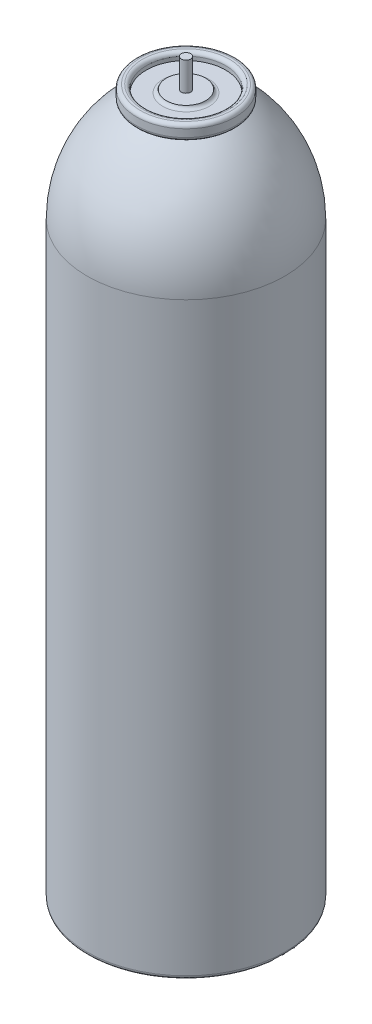
ISO-10303-21;
HEADER;
FILE_DESCRIPTION(('STEP AP214'),'2;1');
FILE_NAME('part.step','',(''),(''),'','','');
FILE_SCHEMA(('AUTOMOTIVE_DESIGN { 1 0 10303 214 1 1 1 1 }'));
ENDSEC;
DATA;
#1=APPLICATION_CONTEXT('core data for automotive mechanical design processes');
#2=APPLICATION_PROTOCOL_DEFINITION('international standard','automotive_design',2000,#1);
#3=PRODUCT_CONTEXT('',#1,'mechanical');
#4=PRODUCT('Part','Part','',(#3));
#5=PRODUCT_RELATED_PRODUCT_CATEGORY('part','',(#4));
#6=PRODUCT_DEFINITION_FORMATION('','',#4);
#7=PRODUCT_DEFINITION_CONTEXT('part definition',#1,'design');
#8=PRODUCT_DEFINITION('design','',#6,#7);
#9=PRODUCT_DEFINITION_SHAPE('','',#8);
#10=(LENGTH_UNIT() NAMED_UNIT(*) SI_UNIT(.MILLI.,.METRE.));
#11=(NAMED_UNIT(*) PLANE_ANGLE_UNIT() SI_UNIT($,.RADIAN.));
#12=(NAMED_UNIT(*) SI_UNIT($,.STERADIAN.) SOLID_ANGLE_UNIT());
#13=UNCERTAINTY_MEASURE_WITH_UNIT(LENGTH_MEASURE(1.E-05),#10,'distance_accuracy_value','');
#14=(GEOMETRIC_REPRESENTATION_CONTEXT(3) GLOBAL_UNCERTAINTY_ASSIGNED_CONTEXT((#13)) GLOBAL_UNIT_ASSIGNED_CONTEXT((#10,
#11,#12)) REPRESENTATION_CONTEXT('',''));
#15=CARTESIAN_POINT('',(0.,0.,0.));
#16=DIRECTION('',(0.,0.,1.));
#17=DIRECTION('',(1.,0.,0.));
#18=AXIS2_PLACEMENT_3D('',#15,#16,#17);
#19=CARTESIAN_POINT('',(0.,-195.980371030515,0.));
#20=DIRECTION('',(0.,-1.,0.));
#21=DIRECTION('',(0.,0.,-1.));
#22=AXIS2_PLACEMENT_3D('',#19,#20,#21);
#23=CYLINDRICAL_SURFACE('',#22,33.3375);
#24=CARTESIAN_POINT('',(0.,1.26999999999999,0.));
#25=DIRECTION('',(0.,-1.,0.));
#26=DIRECTION('',(0.,0.,-1.));
#27=AXIS2_PLACEMENT_3D('',#24,#25,#26);
#28=CIRCLE('',#27,33.3375);
#29=CARTESIAN_POINT('',(0.,1.26999999999999,-33.3375));
#30=VERTEX_POINT('',#29);
#31=EDGE_CURVE('E53',#30,#30,#28,.F.);
#32=ORIENTED_EDGE('',*,*,#31,.T.);
#33=EDGE_LOOP('',(#32));
#34=FACE_BOUND('',#33,.T.);
#35=CARTESIAN_POINT('',(0.,198.713653717167,0.));
#36=DIRECTION('',(0.,-1.,0.));
#37=DIRECTION('',(0.,0.,-1.));
#38=AXIS2_PLACEMENT_3D('',#35,#36,#37);
#39=CIRCLE('',#38,33.3375);
#40=CARTESIAN_POINT('',(0.,198.713653717167,-33.3375));
#41=VERTEX_POINT('',#40);
#42=EDGE_CURVE('E89',#41,#41,#39,.T.);
#43=ORIENTED_EDGE('',*,*,#42,.T.);
#44=EDGE_LOOP('',(#43));
#45=FACE_BOUND('',#44,.T.);
#46=ADVANCED_FACE('F39',(#34,#45),#23,.T.);
#47=CARTESIAN_POINT('',(0.,198.713653717167,0.));
#48=DIRECTION('',(0.,-1.,0.));
#49=DIRECTION('',(0.,0.,-1.));
#50=AXIS2_PLACEMENT_3D('',#47,#48,#49);
#51=DEGENERATE_TOROIDAL_SURFACE('',#50,8.4454704817287,41.7829704817287,.F.);
#52=CARTESIAN_POINT('',(0.,233.045,0.));
#53=DIRECTION('',(0.,-1.,0.));
#54=DIRECTION('',(0.,0.,-1.));
#55=AXIS2_PLACEMENT_3D('',#52,#53,#54);
#56=CIRCLE('',#55,15.369971665861);
#57=CARTESIAN_POINT('',(0.,233.045,-15.369971665861));
#58=VERTEX_POINT('',#57);
#59=EDGE_CURVE('E86',#58,#58,#56,.T.);
#60=ORIENTED_EDGE('',*,*,#59,.T.);
#61=EDGE_LOOP('',(#60));
#62=FACE_BOUND('',#61,.T.);
#63=ORIENTED_EDGE('',*,*,#42,.F.);
#64=EDGE_LOOP('',(#63));
#65=FACE_BOUND('',#64,.T.);
#66=ADVANCED_FACE('F127',(#62,#65),#51,.F.);
#67=CARTESIAN_POINT('',(0.,233.045,0.));
#68=DIRECTION('',(0.,-1.,0.));
#69=DIRECTION('',(0.,0.,-1.));
#70=AXIS2_PLACEMENT_3D('',#67,#68,#69);
#71=PLANE('',#70);
#72=CARTESIAN_POINT('',(0.,233.045,0.));
#73=DIRECTION('',(0.,-1.,0.));
#74=DIRECTION('',(0.,0.,-1.));
#75=AXIS2_PLACEMENT_3D('',#72,#73,#74);
#76=CIRCLE('',#75,15.3924);
#77=CARTESIAN_POINT('',(0.,233.045,-15.3924));
#78=VERTEX_POINT('',#77);
#79=EDGE_CURVE('E80',#78,#78,#76,.T.);
#80=ORIENTED_EDGE('',*,*,#79,.T.);
#81=EDGE_LOOP('',(#80));
#82=FACE_BOUND('',#81,.T.);
#83=ORIENTED_EDGE('',*,*,#59,.F.);
#84=EDGE_LOOP('',(#83));
#85=FACE_BOUND('',#84,.T.);
#86=ADVANCED_FACE('F138',(#82,#85),#71,.T.);
#87=CARTESIAN_POINT('',(0.,-195.980371030515,0.));
#88=DIRECTION('',(0.,-1.,0.));
#89=DIRECTION('',(0.,0.,-1.));
#90=AXIS2_PLACEMENT_3D('',#87,#88,#89);
#91=CYLINDRICAL_SURFACE('',#90,16.6624);
#92=CARTESIAN_POINT('',(0.,234.315,0.));
#93=DIRECTION('',(0.,-1.,0.));
#94=DIRECTION('',(0.,0.,-1.));
#95=AXIS2_PLACEMENT_3D('',#92,#93,#94);
#96=CIRCLE('',#95,16.6624);
#97=CARTESIAN_POINT('',(0.,234.315,-16.6624));
#98=VERTEX_POINT('',#97);
#99=EDGE_CURVE('E71',#98,#98,#96,.F.);
#100=ORIENTED_EDGE('',*,*,#99,.T.);
#101=EDGE_LOOP('',(#100));
#102=FACE_BOUND('',#101,.T.);
#103=CARTESIAN_POINT('',(0.,236.855,0.));
#104=DIRECTION('',(0.,-1.,0.));
#105=DIRECTION('',(0.,0.,-1.));
#106=AXIS2_PLACEMENT_3D('',#103,#104,#105);
#107=CIRCLE('',#106,16.6624);
#108=CARTESIAN_POINT('',(0.,236.855,-16.6624));
#109=VERTEX_POINT('',#108);
#110=EDGE_CURVE('E72',#109,#109,#107,.T.);
#111=ORIENTED_EDGE('',*,*,#110,.T.);
#112=EDGE_LOOP('',(#111));
#113=FACE_BOUND('',#112,.T.);
#114=ADVANCED_FACE('F177',(#102,#113),#91,.T.);
#115=CARTESIAN_POINT('',(0.,238.125,0.));
#116=DIRECTION('',(0.,-1.,0.));
#117=DIRECTION('',(0.,0.,-1.));
#118=AXIS2_PLACEMENT_3D('',#115,#116,#117);
#119=PLANE('',#118);
#120=CARTESIAN_POINT('',(0.,238.125,0.));
#121=DIRECTION('',(0.,-1.,0.));
#122=DIRECTION('',(0.,0.,-1.));
#123=AXIS2_PLACEMENT_3D('',#120,#121,#122);
#124=CIRCLE('',#123,14.6304);
#125=CARTESIAN_POINT('',(0.,238.125,-14.6304));
#126=VERTEX_POINT('',#125);
#127=EDGE_CURVE('E61',#126,#126,#124,.T.);
#128=ORIENTED_EDGE('',*,*,#127,.T.);
#129=EDGE_LOOP('',(#128));
#130=FACE_BOUND('',#129,.T.);
#131=CARTESIAN_POINT('',(0.,238.125,0.));
#132=DIRECTION('',(0.,-1.,0.));
#133=DIRECTION('',(0.,0.,-1.));
#134=AXIS2_PLACEMENT_3D('',#131,#132,#133);
#135=CIRCLE('',#134,15.3924);
#136=CARTESIAN_POINT('',(0.,238.125,-15.3924));
#137=VERTEX_POINT('',#136);
#138=EDGE_CURVE('E67',#137,#137,#135,.F.);
#139=ORIENTED_EDGE('',*,*,#138,.T.);
#140=EDGE_LOOP('',(#139));
#141=FACE_BOUND('',#140,.T.);
#142=ADVANCED_FACE('F167',(#130,#141),#119,.F.);
#143=CARTESIAN_POINT('',(0.,0.,0.));
#144=DIRECTION('',(0.,-1.,0.));
#145=DIRECTION('',(0.,0.,-1.));
#146=AXIS2_PLACEMENT_3D('',#143,#144,#145);
#147=PLANE('',#146);
#148=CARTESIAN_POINT('',(0.,0.,0.));
#149=DIRECTION('',(0.,-1.,0.));
#150=DIRECTION('',(0.,0.,-1.));
#151=AXIS2_PLACEMENT_3D('',#148,#149,#150);
#152=CIRCLE('',#151,29.158803878851);
#153=CARTESIAN_POINT('',(0.,0.,-29.158803878851));
#154=VERTEX_POINT('',#153);
#155=EDGE_CURVE('E46',#154,#154,#152,.F.);
#156=ORIENTED_EDGE('',*,*,#155,.T.);
#157=EDGE_LOOP('',(#156));
#158=FACE_BOUND('',#157,.T.);
#159=CARTESIAN_POINT('',(0.,0.,0.));
#160=DIRECTION('',(0.,-1.,0.));
#161=DIRECTION('',(0.,0.,-1.));
#162=AXIS2_PLACEMENT_3D('',#159,#160,#161);
#163=CIRCLE('',#162,32.0675);
#164=CARTESIAN_POINT('',(0.,0.,-32.0675));
#165=VERTEX_POINT('',#164);
#166=EDGE_CURVE('E56',#165,#165,#163,.T.);
#167=ORIENTED_EDGE('',*,*,#166,.T.);
#168=EDGE_LOOP('',(#167));
#169=FACE_BOUND('',#168,.T.);
#170=ADVANCED_FACE('F166',(#158,#169),#147,.T.);
#171=CARTESIAN_POINT('',(0.,235.585,0.));
#172=DIRECTION('',(0.,1.,0.));
#173=DIRECTION('',(0.,0.,1.));
#174=AXIS2_PLACEMENT_3D('',#171,#172,#173);
#175=CYLINDRICAL_SURFACE('',#174,13.3604);
#176=CARTESIAN_POINT('',(0.,236.855,0.));
#177=DIRECTION('',(0.,-1.,0.));
#178=DIRECTION('',(0.,0.,-1.));
#179=AXIS2_PLACEMENT_3D('',#176,#177,#178);
#180=CIRCLE('',#179,13.3604);
#181=CARTESIAN_POINT('',(0.,236.855,-13.3604));
#182=VERTEX_POINT('',#181);
#183=EDGE_CURVE('E62',#182,#182,#180,.F.);
#184=ORIENTED_EDGE('',*,*,#183,.T.);
#185=EDGE_LOOP('',(#184));
#186=FACE_BOUND('',#185,.T.);
#187=CARTESIAN_POINT('',(0.,235.585,0.));
#188=DIRECTION('',(0.,1.,0.));
#189=DIRECTION('',(0.,0.,1.));
#190=AXIS2_PLACEMENT_3D('',#187,#188,#189);
#191=CIRCLE('',#190,13.3604);
#192=CARTESIAN_POINT('',(0.,235.585,13.3604));
#193=VERTEX_POINT('',#192);
#194=EDGE_CURVE('E93',#193,#193,#191,.T.);
#195=ORIENTED_EDGE('',*,*,#194,.F.);
#196=EDGE_LOOP('',(#195));
#197=FACE_BOUND('',#196,.T.);
#198=ADVANCED_FACE('F169',(#186,#197),#175,.F.);
#199=CARTESIAN_POINT('',(0.,235.585,0.));
#200=DIRECTION('',(0.,1.,0.));
#201=DIRECTION('',(0.,0.,1.));
#202=AXIS2_PLACEMENT_3D('',#199,#200,#201);
#203=PLANE('',#202);
#204=CARTESIAN_POINT('',(0.,235.585,0.));
#205=DIRECTION('',(0.,1.,0.));
#206=DIRECTION('',(0.,0.,1.));
#207=AXIS2_PLACEMENT_3D('',#204,#205,#206);
#208=CIRCLE('',#207,7.85549372879662);
#209=CARTESIAN_POINT('',(0.,235.585,7.85549372879662));
#210=VERTEX_POINT('',#209);
#211=EDGE_CURVE('E10',#210,#210,#208,.F.);
#212=ORIENTED_EDGE('',*,*,#211,.T.);
#213=EDGE_LOOP('',(#212));
#214=FACE_BOUND('',#213,.T.);
#215=ORIENTED_EDGE('',*,*,#194,.T.);
#216=EDGE_LOOP('',(#215));
#217=FACE_BOUND('',#216,.T.);
#218=ADVANCED_FACE('F116',(#214,#217),#203,.T.);
#219=CARTESIAN_POINT('',(0.,236.601,0.));
#220=DIRECTION('',(0.,1.,0.));
#221=DIRECTION('',(0.,0.,1.));
#222=AXIS2_PLACEMENT_3D('',#219,#220,#221);
#223=PLANE('',#222);
#224=CARTESIAN_POINT('',(0.,236.601,0.));
#225=DIRECTION('',(0.,1.,0.));
#226=DIRECTION('',(0.,0.,1.));
#227=AXIS2_PLACEMENT_3D('',#224,#225,#226);
#228=CIRCLE('',#227,1.5875);
#229=CARTESIAN_POINT('',(0.,236.601,1.5875));
#230=VERTEX_POINT('',#229);
#231=EDGE_CURVE('E88',#230,#230,#228,.T.);
#232=ORIENTED_EDGE('',*,*,#231,.F.);
#233=EDGE_LOOP('',(#232));
#234=FACE_BOUND('',#233,.T.);
#235=CARTESIAN_POINT('',(0.,236.601,0.));
#236=DIRECTION('',(0.,1.,0.));
#237=DIRECTION('',(0.,0.,1.));
#238=AXIS2_PLACEMENT_3D('',#235,#236,#237);
#239=CIRCLE('',#238,6.61115293946276);
#240=CARTESIAN_POINT('',(0.,236.601,6.61115293946276));
#241=VERTEX_POINT('',#240);
#242=EDGE_CURVE('E98',#241,#241,#239,.T.);
#243=ORIENTED_EDGE('',*,*,#242,.T.);
#244=EDGE_LOOP('',(#243));
#245=FACE_BOUND('',#244,.T.);
#246=ADVANCED_FACE('F109',(#234,#245),#223,.T.);
#247=CARTESIAN_POINT('',(0.,246.253,0.));
#248=DIRECTION('',(0.,-1.,0.));
#249=DIRECTION('',(0.,0.,-1.));
#250=AXIS2_PLACEMENT_3D('',#247,#248,#249);
#251=CYLINDRICAL_SURFACE('',#250,1.5875);
#252=CARTESIAN_POINT('',(0.,246.253,0.));
#253=DIRECTION('',(0.,1.,0.));
#254=DIRECTION('',(0.,0.,1.));
#255=AXIS2_PLACEMENT_3D('',#252,#253,#254);
#256=CIRCLE('',#255,1.5875);
#257=CARTESIAN_POINT('',(0.,246.253,1.5875));
#258=VERTEX_POINT('',#257);
#259=EDGE_CURVE('E100',#258,#258,#256,.T.);
#260=ORIENTED_EDGE('',*,*,#259,.F.);
#261=EDGE_LOOP('',(#260));
#262=FACE_BOUND('',#261,.T.);
#263=ORIENTED_EDGE('',*,*,#231,.T.);
#264=EDGE_LOOP('',(#263));
#265=FACE_BOUND('',#264,.T.);
#266=ADVANCED_FACE('F110',(#262,#265),#251,.T.);
#267=CARTESIAN_POINT('',(0.,246.253,0.));
#268=DIRECTION('',(0.,1.,0.));
#269=DIRECTION('',(0.,0.,1.));
#270=AXIS2_PLACEMENT_3D('',#267,#268,#269);
#271=PLANE('',#270);
#272=ORIENTED_EDGE('',*,*,#259,.T.);
#273=EDGE_LOOP('',(#272));
#274=FACE_BOUND('',#273,.T.);
#275=ADVANCED_FACE('F102',(#274),#271,.T.);
#276=CARTESIAN_POINT('',(0.,7.11199999999999,0.));
#277=DIRECTION('',(0.,-1.,0.));
#278=DIRECTION('',(0.,0.,-1.));
#279=AXIS2_PLACEMENT_3D('',#276,#277,#278);
#280=CYLINDRICAL_SURFACE('',#279,27.888803878851);
#281=CARTESIAN_POINT('',(0.,1.27,0.));
#282=DIRECTION('',(0.,-1.,0.));
#283=DIRECTION('',(0.,0.,-1.));
#284=AXIS2_PLACEMENT_3D('',#281,#282,#283);
#285=CIRCLE('',#284,27.888803878851);
#286=CARTESIAN_POINT('',(0.,1.27,-27.888803878851));
#287=VERTEX_POINT('',#286);
#288=EDGE_CURVE('E49',#287,#287,#285,.T.);
#289=CARTESIAN_POINT('',(0.,2.03199999999999,0.));
#290=DIRECTION('',(0.,-1.,0.));
#291=DIRECTION('',(0.,0.,-1.));
#292=AXIS2_PLACEMENT_3D('',#289,#290,#291);
#293=CIRCLE('',#292,27.888803878851);
#294=CARTESIAN_POINT('',(0.,2.03199999999999,-27.888803878851));
#295=VERTEX_POINT('',#294);
#296=EDGE_CURVE('E78',#295,#295,#293,.F.);
#297=CARTESIAN_POINT('',(0.,1.27,-27.888803878851));
#298=CARTESIAN_POINT('',(0.,1.2779375,-27.888803878851));
#299=CARTESIAN_POINT('',(0.,1.285875,-27.888803878851));
#300=CARTESIAN_POINT('',(0.,1.30175,-27.888803878851));
#301=CARTESIAN_POINT('',(0.,1.3096875,-27.888803878851));
#302=CARTESIAN_POINT('',(0.,1.3255625,-27.888803878851));
#303=CARTESIAN_POINT('',(0.,1.3335,-27.888803878851));
#304=CARTESIAN_POINT('',(0.,1.349375,-27.888803878851));
#305=CARTESIAN_POINT('',(0.,1.3573125,-27.888803878851));
#306=CARTESIAN_POINT('',(0.,1.3731875,-27.888803878851));
#307=CARTESIAN_POINT('',(0.,1.381125,-27.888803878851));
#308=CARTESIAN_POINT('',(0.,1.397,-27.888803878851));
#309=CARTESIAN_POINT('',(0.,1.4049375,-27.888803878851));
#310=CARTESIAN_POINT('',(0.,1.4208125,-27.888803878851));
#311=CARTESIAN_POINT('',(0.,1.42875,-27.888803878851));
#312=CARTESIAN_POINT('',(0.,1.444625,-27.888803878851));
#313=CARTESIAN_POINT('',(0.,1.4525625,-27.888803878851));
#314=CARTESIAN_POINT('',(0.,1.4684375,-27.888803878851));
#315=CARTESIAN_POINT('',(0.,1.476375,-27.888803878851));
#316=CARTESIAN_POINT('',(0.,1.49225,-27.888803878851));
#317=CARTESIAN_POINT('',(0.,1.5001875,-27.888803878851));
#318=CARTESIAN_POINT('',(0.,1.5160625,-27.888803878851));
#319=CARTESIAN_POINT('',(0.,1.524,-27.888803878851));
#320=CARTESIAN_POINT('',(0.,1.539875,-27.888803878851));
#321=CARTESIAN_POINT('',(0.,1.5478125,-27.888803878851));
#322=CARTESIAN_POINT('',(0.,1.5636875,-27.888803878851));
#323=CARTESIAN_POINT('',(0.,1.571625,-27.888803878851));
#324=CARTESIAN_POINT('',(0.,1.5875,-27.888803878851));
#325=CARTESIAN_POINT('',(0.,1.59543749999999,-27.888803878851));
#326=CARTESIAN_POINT('',(0.,1.61131249999999,-27.888803878851));
#327=CARTESIAN_POINT('',(0.,1.61924999999999,-27.888803878851));
#328=CARTESIAN_POINT('',(0.,1.63512499999999,-27.888803878851));
#329=CARTESIAN_POINT('',(0.,1.64306249999999,-27.888803878851));
#330=CARTESIAN_POINT('',(0.,1.65893749999999,-27.888803878851));
#331=CARTESIAN_POINT('',(0.,1.66687499999999,-27.888803878851));
#332=CARTESIAN_POINT('',(0.,1.68274999999999,-27.888803878851));
#333=CARTESIAN_POINT('',(0.,1.69068749999999,-27.888803878851));
#334=CARTESIAN_POINT('',(0.,1.70656249999999,-27.888803878851));
#335=CARTESIAN_POINT('',(0.,1.71449999999999,-27.888803878851));
#336=CARTESIAN_POINT('',(0.,1.73037499999999,-27.888803878851));
#337=CARTESIAN_POINT('',(0.,1.73831249999999,-27.888803878851));
#338=CARTESIAN_POINT('',(0.,1.75418749999999,-27.888803878851));
#339=CARTESIAN_POINT('',(0.,1.76212499999999,-27.888803878851));
#340=CARTESIAN_POINT('',(0.,1.77799999999999,-27.888803878851));
#341=CARTESIAN_POINT('',(0.,1.78593749999999,-27.888803878851));
#342=CARTESIAN_POINT('',(0.,1.80181249999999,-27.888803878851));
#343=CARTESIAN_POINT('',(0.,1.80974999999999,-27.888803878851));
#344=CARTESIAN_POINT('',(0.,1.82562499999999,-27.888803878851));
#345=CARTESIAN_POINT('',(0.,1.83356249999999,-27.888803878851));
#346=CARTESIAN_POINT('',(0.,1.84943749999999,-27.888803878851));
#347=CARTESIAN_POINT('',(0.,1.85737499999999,-27.888803878851));
#348=CARTESIAN_POINT('',(0.,1.87324999999999,-27.888803878851));
#349=CARTESIAN_POINT('',(0.,1.88118749999999,-27.888803878851));
#350=CARTESIAN_POINT('',(0.,1.89706249999999,-27.888803878851));
#351=CARTESIAN_POINT('',(0.,1.90499999999999,-27.888803878851));
#352=CARTESIAN_POINT('',(0.,1.92087499999999,-27.888803878851));
#353=CARTESIAN_POINT('',(0.,1.92881249999999,-27.888803878851));
#354=CARTESIAN_POINT('',(0.,1.94468749999999,-27.888803878851));
#355=CARTESIAN_POINT('',(0.,1.95262499999999,-27.888803878851));
#356=CARTESIAN_POINT('',(0.,1.96849999999999,-27.888803878851));
#357=CARTESIAN_POINT('',(0.,1.97643749999999,-27.888803878851));
#358=CARTESIAN_POINT('',(0.,1.99231249999999,-27.888803878851));
#359=CARTESIAN_POINT('',(0.,2.00024999999999,-27.888803878851));
#360=CARTESIAN_POINT('',(0.,2.01612499999999,-27.888803878851));
#361=CARTESIAN_POINT('',(0.,2.02406249999999,-27.888803878851));
#362=CARTESIAN_POINT('',(0.,2.03199999999999,-27.888803878851));
#363=B_SPLINE_CURVE_WITH_KNOTS('',3,(#297,#298,#299,#300,#301,#302,#303,#304,#305,#306,#307,
#308,#309,#310,#311,#312,#313,#314,#315,#316,#317,#318,#319,#320,#321,#322,#323,#324,#325,#326,
#327,#328,#329,#330,#331,#332,#333,#334,#335,#336,#337,#338,#339,#340,#341,#342,#343,#344,#345,
#346,#347,#348,#349,#350,#351,#352,#353,#354,#355,#356,#357,#358,#359,#360,#361,#362),
.UNSPECIFIED.,.F.,.F.,(4,2,2,2,2,2,2,2,2,2,2,2,2,2,2,2,2,2,2,2,2,2,2,2,2,2,2,2,2,2,2,2,4),(0.,
0.0238124999999995,0.0476249999999991,0.0714374999999986,0.0952499999999981,0.119062499999998,
0.142874999999997,0.166687499999997,0.190499999999996,0.214312499999996,0.238124999999995,
0.261937499999995,0.285749999999994,0.309562499999994,0.333374999999993,0.357187499999993,
0.380999999999992,0.404812499999992,0.428624999999991,0.452437499999991,0.476249999999991,
0.50006249999999,0.52387499999999,0.547687499999989,0.571499999999989,0.595312499999988,
0.619124999999988,0.642937499999987,0.666749999999987,0.690562499999986,0.714374999999986,
0.738187499999985,0.761999999999985),.UNSPECIFIED.);
#364=EDGE_CURVE('BSEAM248',#287,#295,#363,.T.);
#365=ORIENTED_EDGE('',*,*,#288,.T.);
#366=ORIENTED_EDGE('',*,*,#296,.T.);
#367=ORIENTED_EDGE('',*,*,#364,.T.);
#368=ORIENTED_EDGE('',*,*,#364,.F.);
#369=EDGE_LOOP('',(#365,#367,#366,#368));
#370=FACE_BOUND('',#369,.T.);
#371=ADVANCED_FACE('F248',(#370),#280,.F.);
#372=CARTESIAN_POINT('',(0.,7.11199999999999,0.));
#373=DIRECTION('',(0.,-1.,0.));
#374=DIRECTION('',(0.,0.,-1.));
#375=AXIS2_PLACEMENT_3D('',#372,#373,#374);
#376=PLANE('',#375);
#377=CARTESIAN_POINT('',(0.,7.11199999999999,0.));
#378=DIRECTION('',(0.,-1.,0.));
#379=DIRECTION('',(0.,0.,-1.));
#380=AXIS2_PLACEMENT_3D('',#377,#378,#379);
#381=CIRCLE('',#380,22.808803878851);
#382=CARTESIAN_POINT('',(0.,7.11199999999999,-22.808803878851));
#383=VERTEX_POINT('',#382);
#384=EDGE_CURVE('E85',#383,#383,#381,.T.);
#385=ORIENTED_EDGE('',*,*,#384,.T.);
#386=EDGE_LOOP('',(#385));
#387=FACE_BOUND('',#386,.T.);
#388=ADVANCED_FACE('F150',(#387),#376,.T.);
#389=CARTESIAN_POINT('',(0.,2.03199999999999,0.));
#390=DIRECTION('',(0.,-1.,0.));
#391=DIRECTION('',(0.,0.,-1.));
#392=AXIS2_PLACEMENT_3D('',#389,#390,#391);
#393=TOROIDAL_SURFACE('',#392,22.808803878851,5.08);
#394=ORIENTED_EDGE('',*,*,#296,.F.);
#395=EDGE_LOOP('',(#394));
#396=FACE_BOUND('',#395,.T.);
#397=ORIENTED_EDGE('',*,*,#384,.F.);
#398=EDGE_LOOP('',(#397));
#399=FACE_BOUND('',#398,.T.);
#400=ADVANCED_FACE('F144',(#396,#399),#393,.F.);
#401=CARTESIAN_POINT('',(0.,234.315,0.));
#402=DIRECTION('',(0.,-1.,0.));
#403=DIRECTION('',(0.,0.,-1.));
#404=AXIS2_PLACEMENT_3D('',#401,#402,#403);
#405=TOROIDAL_SURFACE('',#404,15.3924,1.27);
#406=ORIENTED_EDGE('',*,*,#99,.F.);
#407=EDGE_LOOP('',(#406));
#408=FACE_BOUND('',#407,.T.);
#409=ORIENTED_EDGE('',*,*,#79,.F.);
#410=EDGE_LOOP('',(#409));
#411=FACE_BOUND('',#410,.T.);
#412=ADVANCED_FACE('F146',(#408,#411),#405,.T.);
#413=CARTESIAN_POINT('',(0.,236.855,0.));
#414=DIRECTION('',(0.,-1.,0.));
#415=DIRECTION('',(0.,0.,-1.));
#416=AXIS2_PLACEMENT_3D('',#413,#414,#415);
#417=TOROIDAL_SURFACE('',#416,15.3924,1.27);
#418=ORIENTED_EDGE('',*,*,#138,.F.);
#419=EDGE_LOOP('',(#418));
#420=FACE_BOUND('',#419,.T.);
#421=ORIENTED_EDGE('',*,*,#110,.F.);
#422=EDGE_LOOP('',(#421));
#423=FACE_BOUND('',#422,.T.);
#424=ADVANCED_FACE('F154',(#420,#423),#417,.T.);
#425=CARTESIAN_POINT('',(0.,236.855,0.));
#426=DIRECTION('',(0.,-1.,0.));
#427=DIRECTION('',(0.,0.,-1.));
#428=AXIS2_PLACEMENT_3D('',#425,#426,#427);
#429=TOROIDAL_SURFACE('',#428,14.6304,1.27);
#430=ORIENTED_EDGE('',*,*,#127,.F.);
#431=EDGE_LOOP('',(#430));
#432=FACE_BOUND('',#431,.T.);
#433=ORIENTED_EDGE('',*,*,#183,.F.);
#434=EDGE_LOOP('',(#433));
#435=FACE_BOUND('',#434,.T.);
#436=ADVANCED_FACE('F156',(#432,#435),#429,.T.);
#437=CARTESIAN_POINT('',(0.,1.26999999999999,0.));
#438=DIRECTION('',(0.,-1.,0.));
#439=DIRECTION('',(0.,0.,-1.));
#440=AXIS2_PLACEMENT_3D('',#437,#438,#439);
#441=TOROIDAL_SURFACE('',#440,32.0675,1.27);
#442=ORIENTED_EDGE('',*,*,#31,.F.);
#443=EDGE_LOOP('',(#442));
#444=FACE_BOUND('',#443,.T.);
#445=ORIENTED_EDGE('',*,*,#166,.F.);
#446=EDGE_LOOP('',(#445));
#447=FACE_BOUND('',#446,.T.);
#448=ADVANCED_FACE('F126',(#444,#447),#441,.T.);
#449=CARTESIAN_POINT('',(0.,1.27,0.));
#450=DIRECTION('',(0.,-1.,0.));
#451=DIRECTION('',(0.,0.,-1.));
#452=AXIS2_PLACEMENT_3D('',#449,#450,#451);
#453=TOROIDAL_SURFACE('',#452,29.158803878851,1.27);
#454=ORIENTED_EDGE('',*,*,#155,.F.);
#455=EDGE_LOOP('',(#454));
#456=FACE_BOUND('',#455,.T.);
#457=ORIENTED_EDGE('',*,*,#288,.F.);
#458=EDGE_LOOP('',(#457));
#459=FACE_BOUND('',#458,.T.);
#460=ADVANCED_FACE('F122',(#456,#459),#453,.T.);
#461=CARTESIAN_POINT('',(0.,236.855,0.));
#462=DIRECTION('',(0.,1.,0.));
#463=DIRECTION('',(0.,0.,1.));
#464=AXIS2_PLACEMENT_3D('',#461,#462,#463);
#465=TOROIDAL_SURFACE('',#464,7.85549372879662,1.27);
#466=ORIENTED_EDGE('',*,*,#211,.F.);
#467=EDGE_LOOP('',(#466));
#468=FACE_BOUND('',#467,.T.);
#469=ORIENTED_EDGE('',*,*,#242,.F.);
#470=EDGE_LOOP('',(#469));
#471=FACE_BOUND('',#470,.T.);
#472=ADVANCED_FACE('F41',(#468,#471),#465,.F.);
#473=CLOSED_SHELL('',(#46,#66,#86,#114,#142,#170,#198,#218,#246,#266,#275,#371,#388,#400,#412,
#424,#436,#448,#460,#472));
#474=MANIFOLD_SOLID_BREP('B2',#473);
#475=ADVANCED_BREP_SHAPE_REPRESENTATION('',(#18,#474),#14);
#476=SHAPE_DEFINITION_REPRESENTATION(#9,#475);
ENDSEC;
END-ISO-10303-21;
